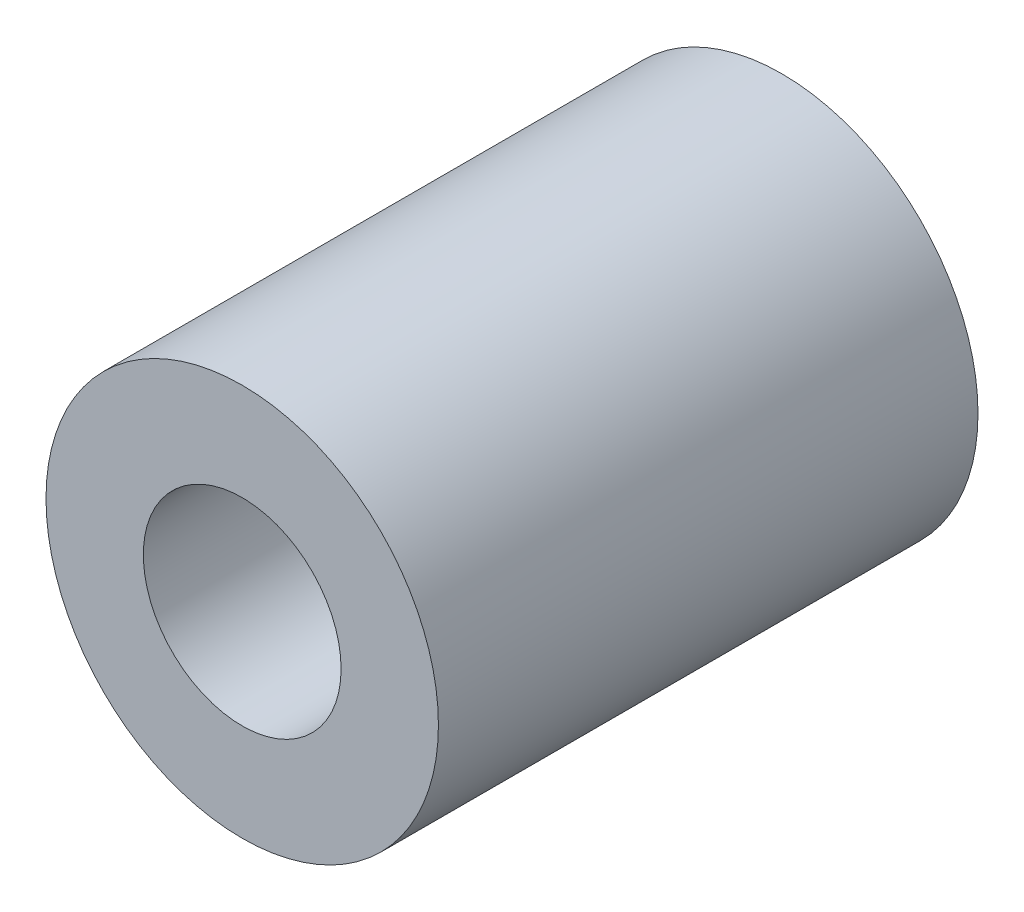
ISO-10303-21;
HEADER;
FILE_DESCRIPTION(('STEP AP214'),'2;1');
FILE_NAME('part.step','',(''),(''),'','','');
FILE_SCHEMA(('AUTOMOTIVE_DESIGN { 1 0 10303 214 1 1 1 1 }'));
ENDSEC;
DATA;
#1=APPLICATION_CONTEXT('core data for automotive mechanical design processes');
#2=APPLICATION_PROTOCOL_DEFINITION('international standard','automotive_design',2000,#1);
#3=PRODUCT_CONTEXT('',#1,'mechanical');
#4=PRODUCT('Part','Part','',(#3));
#5=PRODUCT_RELATED_PRODUCT_CATEGORY('part','',(#4));
#6=PRODUCT_DEFINITION_FORMATION('','',#4);
#7=PRODUCT_DEFINITION_CONTEXT('part definition',#1,'design');
#8=PRODUCT_DEFINITION('design','',#6,#7);
#9=PRODUCT_DEFINITION_SHAPE('','',#8);
#10=(LENGTH_UNIT() NAMED_UNIT(*) SI_UNIT(.MILLI.,.METRE.));
#11=(NAMED_UNIT(*) PLANE_ANGLE_UNIT() SI_UNIT($,.RADIAN.));
#12=(NAMED_UNIT(*) SI_UNIT($,.STERADIAN.) SOLID_ANGLE_UNIT());
#13=UNCERTAINTY_MEASURE_WITH_UNIT(LENGTH_MEASURE(1.E-05),#10,'distance_accuracy_value','');
#14=(GEOMETRIC_REPRESENTATION_CONTEXT(3) GLOBAL_UNCERTAINTY_ASSIGNED_CONTEXT((#13)) GLOBAL_UNIT_ASSIGNED_CONTEXT((#10,
#11,#12)) REPRESENTATION_CONTEXT('',''));
#15=CARTESIAN_POINT('',(0.,0.,0.));
#16=DIRECTION('',(0.,0.,1.));
#17=DIRECTION('',(1.,0.,0.));
#18=AXIS2_PLACEMENT_3D('',#15,#16,#17);
#19=CARTESIAN_POINT('',(0.,0.,8.73125));
#20=DIRECTION('',(0.,0.,1.));
#21=DIRECTION('',(1.,0.,0.));
#22=AXIS2_PLACEMENT_3D('',#19,#20,#21);
#23=PLANE('',#22);
#24=CARTESIAN_POINT('',(0.,0.,8.73125));
#25=DIRECTION('',(0.,0.,1.));
#26=DIRECTION('',(1.,0.,0.));
#27=AXIS2_PLACEMENT_3D('',#24,#25,#26);
#28=CIRCLE('',#27,6.35);
#29=CARTESIAN_POINT('',(6.35,0.,8.73125));
#30=VERTEX_POINT('',#29);
#31=EDGE_CURVE('E10',#30,#30,#28,.T.);
#32=ORIENTED_EDGE('',*,*,#31,.T.);
#33=EDGE_LOOP('',(#32));
#34=FACE_BOUND('',#33,.T.);
#35=CARTESIAN_POINT('',(0.,0.,8.73125));
#36=DIRECTION('',(0.,0.,1.));
#37=DIRECTION('',(1.,0.,0.));
#38=AXIS2_PLACEMENT_3D('',#35,#36,#37);
#39=CIRCLE('',#38,3.2004);
#40=CARTESIAN_POINT('',(3.2004,0.,8.73125));
#41=VERTEX_POINT('',#40);
#42=EDGE_CURVE('E40',#41,#41,#39,.T.);
#43=ORIENTED_EDGE('',*,*,#42,.F.);
#44=EDGE_LOOP('',(#43));
#45=FACE_BOUND('',#44,.T.);
#46=ADVANCED_FACE('F29',(#34,#45),#23,.T.);
#47=CARTESIAN_POINT('',(0.,0.,-8.73125));
#48=DIRECTION('',(0.,0.,1.));
#49=DIRECTION('',(1.,0.,0.));
#50=AXIS2_PLACEMENT_3D('',#47,#48,#49);
#51=PLANE('',#50);
#52=CARTESIAN_POINT('',(0.,0.,-8.73125));
#53=DIRECTION('',(0.,0.,1.));
#54=DIRECTION('',(1.,0.,0.));
#55=AXIS2_PLACEMENT_3D('',#52,#53,#54);
#56=CIRCLE('',#55,6.35);
#57=CARTESIAN_POINT('',(6.35,0.,-8.73125));
#58=VERTEX_POINT('',#57);
#59=EDGE_CURVE('E33',#58,#58,#56,.T.);
#60=ORIENTED_EDGE('',*,*,#59,.F.);
#61=EDGE_LOOP('',(#60));
#62=FACE_BOUND('',#61,.T.);
#63=CARTESIAN_POINT('',(0.,0.,-8.73125));
#64=DIRECTION('',(0.,0.,1.));
#65=DIRECTION('',(1.,0.,0.));
#66=AXIS2_PLACEMENT_3D('',#63,#64,#65);
#67=CIRCLE('',#66,3.2004);
#68=CARTESIAN_POINT('',(3.2004,0.,-8.73125));
#69=VERTEX_POINT('',#68);
#70=EDGE_CURVE('E42',#69,#69,#67,.T.);
#71=ORIENTED_EDGE('',*,*,#70,.T.);
#72=EDGE_LOOP('',(#71));
#73=FACE_BOUND('',#72,.T.);
#74=ADVANCED_FACE('F52',(#62,#73),#51,.F.);
#75=CARTESIAN_POINT('',(0.,0.,8.73125));
#76=DIRECTION('',(0.,0.,-1.));
#77=DIRECTION('',(-1.,0.,0.));
#78=AXIS2_PLACEMENT_3D('',#75,#76,#77);
#79=CYLINDRICAL_SURFACE('',#78,6.35);
#80=ORIENTED_EDGE('',*,*,#31,.F.);
#81=EDGE_LOOP('',(#80));
#82=FACE_BOUND('',#81,.T.);
#83=ORIENTED_EDGE('',*,*,#59,.T.);
#84=EDGE_LOOP('',(#83));
#85=FACE_BOUND('',#84,.T.);
#86=ADVANCED_FACE('F31',(#82,#85),#79,.T.);
#87=CARTESIAN_POINT('',(0.,0.,8.73125));
#88=DIRECTION('',(0.,0.,-1.));
#89=DIRECTION('',(-1.,0.,0.));
#90=AXIS2_PLACEMENT_3D('',#87,#88,#89);
#91=CYLINDRICAL_SURFACE('',#90,3.2004);
#92=ORIENTED_EDGE('',*,*,#42,.T.);
#93=EDGE_LOOP('',(#92));
#94=FACE_BOUND('',#93,.T.);
#95=ORIENTED_EDGE('',*,*,#70,.F.);
#96=EDGE_LOOP('',(#95));
#97=FACE_BOUND('',#96,.T.);
#98=ADVANCED_FACE('F48',(#94,#97),#91,.F.);
#99=CLOSED_SHELL('',(#46,#74,#86,#98));
#100=MANIFOLD_SOLID_BREP('B2',#99);
#101=ADVANCED_BREP_SHAPE_REPRESENTATION('',(#18,#100),#14);
#102=SHAPE_DEFINITION_REPRESENTATION(#9,#101);
ENDSEC;
END-ISO-10303-21;
